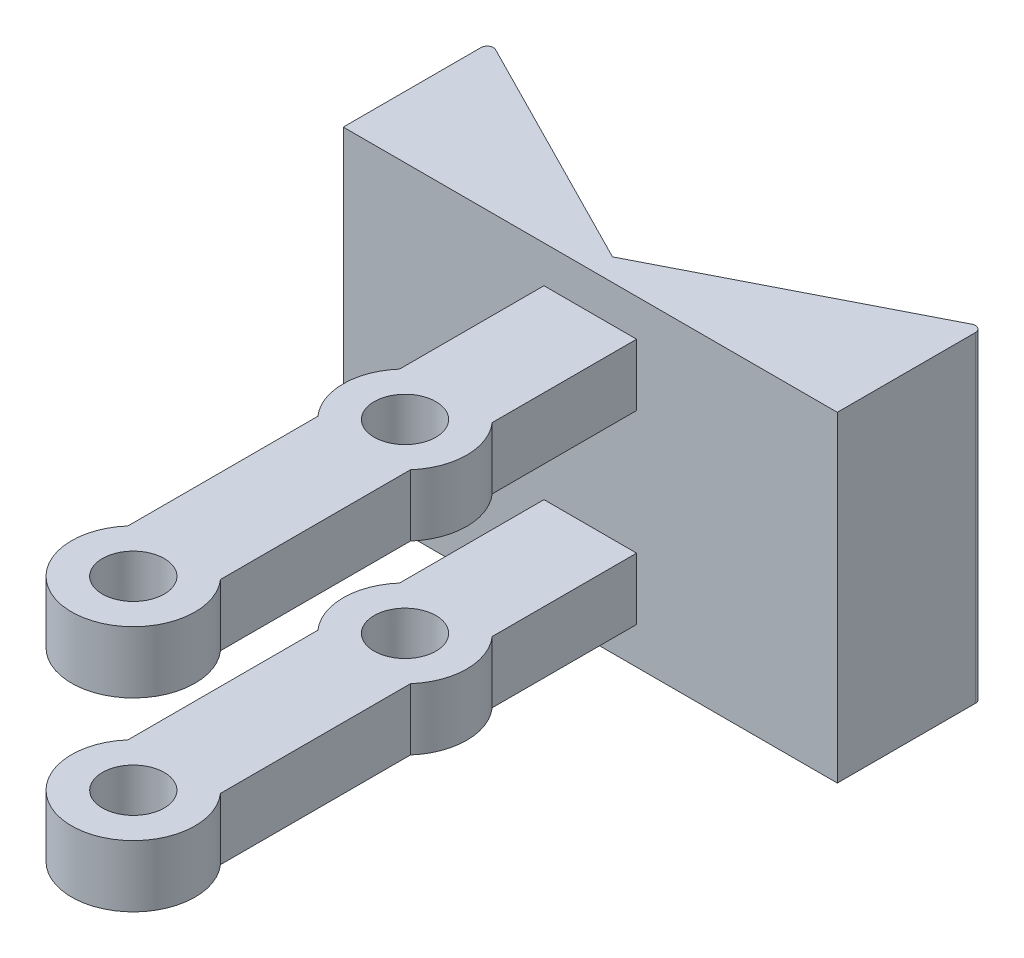
ISO-10303-21;
HEADER;
FILE_DESCRIPTION(('STEP AP214'),'2;1');
FILE_NAME('part.step','',(''),(''),'','','');
FILE_SCHEMA(('AUTOMOTIVE_DESIGN { 1 0 10303 214 1 1 1 1 }'));
ENDSEC;
DATA;
#1=APPLICATION_CONTEXT('core data for automotive mechanical design processes');
#2=APPLICATION_PROTOCOL_DEFINITION('international standard','automotive_design',2000,#1);
#3=PRODUCT_CONTEXT('',#1,'mechanical');
#4=PRODUCT('Part','Part','',(#3));
#5=PRODUCT_RELATED_PRODUCT_CATEGORY('part','',(#4));
#6=PRODUCT_DEFINITION_FORMATION('','',#4);
#7=PRODUCT_DEFINITION_CONTEXT('part definition',#1,'design');
#8=PRODUCT_DEFINITION('design','',#6,#7);
#9=PRODUCT_DEFINITION_SHAPE('','',#8);
#10=(LENGTH_UNIT() NAMED_UNIT(*) SI_UNIT(.MILLI.,.METRE.));
#11=(NAMED_UNIT(*) PLANE_ANGLE_UNIT() SI_UNIT($,.RADIAN.));
#12=(NAMED_UNIT(*) SI_UNIT($,.STERADIAN.) SOLID_ANGLE_UNIT());
#13=UNCERTAINTY_MEASURE_WITH_UNIT(LENGTH_MEASURE(1.E-05),#10,'distance_accuracy_value','');
#14=(GEOMETRIC_REPRESENTATION_CONTEXT(3) GLOBAL_UNCERTAINTY_ASSIGNED_CONTEXT((#13)) GLOBAL_UNIT_ASSIGNED_CONTEXT((#10,
#11,#12)) REPRESENTATION_CONTEXT('',''));
#15=CARTESIAN_POINT('',(0.,0.,0.));
#16=DIRECTION('',(0.,0.,1.));
#17=DIRECTION('',(1.,0.,0.));
#18=AXIS2_PLACEMENT_3D('',#15,#16,#17);
#19=CARTESIAN_POINT('',(-3.75,20.,9.33438241969781));
#20=DIRECTION('',(1.,0.,0.));
#21=DIRECTION('',(0.,0.,-1.));
#22=AXIS2_PLACEMENT_3D('',#19,#20,#21);
#23=PLANE('',#22);
#24=DIRECTION('',(0.,0.,-1.));
#25=VECTOR('',#24,1.);
#26=CARTESIAN_POINT('',(-3.75,15.,9.33438241969781));
#27=LINE('',#26,#25);
#28=CARTESIAN_POINT('',(-3.75,15.,21.0271932808671));
#29=VERTEX_POINT('',#28);
#30=CARTESIAN_POINT('',(-3.75,15.,9.3343824196978));
#31=VERTEX_POINT('',#30);
#32=EDGE_CURVE('E308',#29,#31,#27,.T.);
#33=ORIENTED_EDGE('',*,*,#32,.F.);
#34=DIRECTION('',(0.,-1.,0.));
#35=VECTOR('',#34,1.);
#36=CARTESIAN_POINT('',(-3.75,20.,21.0271932808671));
#37=LINE('',#36,#35);
#38=CARTESIAN_POINT('',(-3.75,20.,21.0271932808671));
#39=VERTEX_POINT('',#38);
#40=EDGE_CURVE('E407',#39,#29,#37,.T.);
#41=ORIENTED_EDGE('',*,*,#40,.F.);
#42=DIRECTION('',(0.,0.,1.));
#43=VECTOR('',#42,1.);
#44=CARTESIAN_POINT('',(-3.75,20.,9.33438241969781));
#45=LINE('',#44,#43);
#46=CARTESIAN_POINT('',(-3.75,20.,9.33438241969781));
#47=VERTEX_POINT('',#46);
#48=EDGE_CURVE('E328',#47,#39,#45,.T.);
#49=ORIENTED_EDGE('',*,*,#48,.F.);
#50=DIRECTION('',(0.,-1.,0.));
#51=VECTOR('',#50,1.);
#52=CARTESIAN_POINT('',(-3.75,20.,9.33438241969781));
#53=LINE('',#52,#51);
#54=EDGE_CURVE('E412',#47,#31,#53,.T.);
#55=ORIENTED_EDGE('',*,*,#54,.T.);
#56=EDGE_LOOP('',(#33,#41,#49,#55));
#57=FACE_BOUND('',#56,.T.);
#58=ADVANCED_FACE('F39',(#57),#23,.F.);
#59=CARTESIAN_POINT('',(0.,20.,24.3343824196978));
#60=DIRECTION('',(0.,-1.,0.));
#61=DIRECTION('',(0.,0.,-1.));
#62=AXIS2_PLACEMENT_3D('',#59,#60,#61);
#63=CYLINDRICAL_SURFACE('',#62,5.);
#64=CARTESIAN_POINT('',(0.,15.,24.3343824196978));
#65=DIRECTION('',(0.,-1.,0.));
#66=DIRECTION('',(0.,0.,-1.));
#67=AXIS2_PLACEMENT_3D('',#64,#65,#66);
#68=CIRCLE('',#67,5.);
#69=CARTESIAN_POINT('',(-3.74999999999999,15.,27.6415715585286));
#70=VERTEX_POINT('',#69);
#71=EDGE_CURVE('E305',#70,#29,#68,.T.);
#72=ORIENTED_EDGE('',*,*,#71,.F.);
#73=DIRECTION('',(0.,-1.,0.));
#74=VECTOR('',#73,1.);
#75=CARTESIAN_POINT('',(-3.74999999999999,20.,27.6415715585286));
#76=LINE('',#75,#74);
#77=CARTESIAN_POINT('',(-3.74999999999999,20.,27.6415715585286));
#78=VERTEX_POINT('',#77);
#79=EDGE_CURVE('E402',#78,#70,#76,.T.);
#80=ORIENTED_EDGE('',*,*,#79,.F.);
#81=CARTESIAN_POINT('',(0.,20.,24.3343824196978));
#82=DIRECTION('',(0.,1.,0.));
#83=DIRECTION('',(0.,0.,1.));
#84=AXIS2_PLACEMENT_3D('',#81,#82,#83);
#85=CIRCLE('',#84,5.);
#86=EDGE_CURVE('E331',#39,#78,#85,.T.);
#87=ORIENTED_EDGE('',*,*,#86,.F.);
#88=ORIENTED_EDGE('',*,*,#40,.T.);
#89=EDGE_LOOP('',(#72,#80,#87,#88));
#90=FACE_BOUND('',#89,.T.);
#91=ADVANCED_FACE('F512',(#90),#63,.T.);
#92=CARTESIAN_POINT('',(-3.74999999999999,20.,27.6415715585286));
#93=DIRECTION('',(1.,0.,0.));
#94=DIRECTION('',(0.,0.,-1.));
#95=AXIS2_PLACEMENT_3D('',#92,#93,#94);
#96=PLANE('',#95);
#97=DIRECTION('',(0.,0.,-1.));
#98=VECTOR('',#97,1.);
#99=CARTESIAN_POINT('',(-3.74999999999999,15.,27.6415715585286));
#100=LINE('',#99,#98);
#101=CARTESIAN_POINT('',(-3.74999999999999,15.,43.0271932808671));
#102=VERTEX_POINT('',#101);
#103=EDGE_CURVE('E302',#102,#70,#100,.T.);
#104=ORIENTED_EDGE('',*,*,#103,.F.);
#105=DIRECTION('',(0.,-1.,0.));
#106=VECTOR('',#105,1.);
#107=CARTESIAN_POINT('',(-3.74999999999999,20.,43.0271932808671));
#108=LINE('',#107,#106);
#109=CARTESIAN_POINT('',(-3.74999999999999,20.,43.0271932808671));
#110=VERTEX_POINT('',#109);
#111=EDGE_CURVE('E397',#110,#102,#108,.T.);
#112=ORIENTED_EDGE('',*,*,#111,.F.);
#113=DIRECTION('',(0.,0.,1.));
#114=VECTOR('',#113,1.);
#115=CARTESIAN_POINT('',(-3.74999999999999,20.,27.6415715585286));
#116=LINE('',#115,#114);
#117=EDGE_CURVE('E335',#78,#110,#116,.T.);
#118=ORIENTED_EDGE('',*,*,#117,.F.);
#119=ORIENTED_EDGE('',*,*,#79,.T.);
#120=EDGE_LOOP('',(#104,#112,#118,#119));
#121=FACE_BOUND('',#120,.T.);
#122=ADVANCED_FACE('F518',(#121),#96,.F.);
#123=CARTESIAN_POINT('',(0.,20.,46.3343824196978));
#124=DIRECTION('',(0.,-1.,0.));
#125=DIRECTION('',(0.,0.,-1.));
#126=AXIS2_PLACEMENT_3D('',#123,#124,#125);
#127=CYLINDRICAL_SURFACE('',#126,5.);
#128=CARTESIAN_POINT('',(0.,15.,46.3343824196978));
#129=DIRECTION('',(0.,-1.,0.));
#130=DIRECTION('',(0.,0.,-1.));
#131=AXIS2_PLACEMENT_3D('',#128,#129,#130);
#132=CIRCLE('',#131,5.);
#133=CARTESIAN_POINT('',(3.75000000000001,15.,43.0271932808671));
#134=VERTEX_POINT('',#133);
#135=EDGE_CURVE('E299',#134,#102,#132,.T.);
#136=ORIENTED_EDGE('',*,*,#135,.F.);
#137=DIRECTION('',(0.,-1.,0.));
#138=VECTOR('',#137,1.);
#139=CARTESIAN_POINT('',(3.75000000000001,20.,43.0271932808671));
#140=LINE('',#139,#138);
#141=CARTESIAN_POINT('',(3.75000000000001,20.,43.0271932808671));
#142=VERTEX_POINT('',#141);
#143=EDGE_CURVE('E392',#142,#134,#140,.T.);
#144=ORIENTED_EDGE('',*,*,#143,.F.);
#145=CARTESIAN_POINT('',(0.,20.,46.3343824196978));
#146=DIRECTION('',(0.,1.,0.));
#147=DIRECTION('',(0.,0.,1.));
#148=AXIS2_PLACEMENT_3D('',#145,#146,#147);
#149=CIRCLE('',#148,5.);
#150=EDGE_CURVE('E338',#110,#142,#149,.T.);
#151=ORIENTED_EDGE('',*,*,#150,.F.);
#152=ORIENTED_EDGE('',*,*,#111,.T.);
#153=EDGE_LOOP('',(#136,#144,#151,#152));
#154=FACE_BOUND('',#153,.T.);
#155=ADVANCED_FACE('F680',(#154),#127,.T.);
#156=CARTESIAN_POINT('',(3.75000000000001,20.,43.0271932808671));
#157=DIRECTION('',(-1.,0.,0.));
#158=DIRECTION('',(0.,0.,1.));
#159=AXIS2_PLACEMENT_3D('',#156,#157,#158);
#160=PLANE('',#159);
#161=DIRECTION('',(0.,0.,1.));
#162=VECTOR('',#161,1.);
#163=CARTESIAN_POINT('',(3.75000000000001,15.,43.0271932808671));
#164=LINE('',#163,#162);
#165=CARTESIAN_POINT('',(3.75,15.,27.6415715585286));
#166=VERTEX_POINT('',#165);
#167=EDGE_CURVE('E296',#166,#134,#164,.T.);
#168=ORIENTED_EDGE('',*,*,#167,.F.);
#169=DIRECTION('',(0.,-1.,0.));
#170=VECTOR('',#169,1.);
#171=CARTESIAN_POINT('',(3.75,20.,27.6415715585286));
#172=LINE('',#171,#170);
#173=CARTESIAN_POINT('',(3.75,20.,27.6415715585286));
#174=VERTEX_POINT('',#173);
#175=EDGE_CURVE('E387',#174,#166,#172,.T.);
#176=ORIENTED_EDGE('',*,*,#175,.F.);
#177=DIRECTION('',(0.,0.,-1.));
#178=VECTOR('',#177,1.);
#179=CARTESIAN_POINT('',(3.75000000000001,20.,43.0271932808671));
#180=LINE('',#179,#178);
#181=EDGE_CURVE('E341',#142,#174,#180,.T.);
#182=ORIENTED_EDGE('',*,*,#181,.F.);
#183=ORIENTED_EDGE('',*,*,#143,.T.);
#184=EDGE_LOOP('',(#168,#176,#182,#183));
#185=FACE_BOUND('',#184,.T.);
#186=ADVANCED_FACE('F508',(#185),#160,.F.);
#187=CARTESIAN_POINT('',(0.,20.,24.3343824196978));
#188=DIRECTION('',(0.,-1.,0.));
#189=DIRECTION('',(0.,0.,-1.));
#190=AXIS2_PLACEMENT_3D('',#187,#188,#189);
#191=CYLINDRICAL_SURFACE('',#190,5.);
#192=CARTESIAN_POINT('',(0.,15.,24.3343824196978));
#193=DIRECTION('',(0.,-1.,0.));
#194=DIRECTION('',(0.,0.,-1.));
#195=AXIS2_PLACEMENT_3D('',#192,#193,#194);
#196=CIRCLE('',#195,5.);
#197=CARTESIAN_POINT('',(3.75,15.,21.0271932808671));
#198=VERTEX_POINT('',#197);
#199=EDGE_CURVE('E293',#198,#166,#196,.T.);
#200=ORIENTED_EDGE('',*,*,#199,.F.);
#201=DIRECTION('',(0.,-1.,0.));
#202=VECTOR('',#201,1.);
#203=CARTESIAN_POINT('',(3.75000000000001,20.,21.0271932808671));
#204=LINE('',#203,#202);
#205=CARTESIAN_POINT('',(3.75000000000001,20.,21.0271932808671));
#206=VERTEX_POINT('',#205);
#207=EDGE_CURVE('E382',#206,#198,#204,.T.);
#208=ORIENTED_EDGE('',*,*,#207,.F.);
#209=CARTESIAN_POINT('',(0.,20.,24.3343824196978));
#210=DIRECTION('',(0.,1.,0.));
#211=DIRECTION('',(0.,0.,1.));
#212=AXIS2_PLACEMENT_3D('',#209,#210,#211);
#213=CIRCLE('',#212,5.);
#214=EDGE_CURVE('E344',#174,#206,#213,.T.);
#215=ORIENTED_EDGE('',*,*,#214,.F.);
#216=ORIENTED_EDGE('',*,*,#175,.T.);
#217=EDGE_LOOP('',(#200,#208,#215,#216));
#218=FACE_BOUND('',#217,.T.);
#219=ADVANCED_FACE('F499',(#218),#191,.T.);
#220=CARTESIAN_POINT('',(3.75,20.,21.0271932808671));
#221=DIRECTION('',(-1.,0.,0.));
#222=DIRECTION('',(0.,0.,1.));
#223=AXIS2_PLACEMENT_3D('',#220,#221,#222);
#224=PLANE('',#223);
#225=DIRECTION('',(0.,0.,1.));
#226=VECTOR('',#225,1.);
#227=CARTESIAN_POINT('',(3.75,15.,21.0271932808671));
#228=LINE('',#227,#226);
#229=CARTESIAN_POINT('',(3.75,15.,9.3343824196978));
#230=VERTEX_POINT('',#229);
#231=EDGE_CURVE('E290',#230,#198,#228,.T.);
#232=ORIENTED_EDGE('',*,*,#231,.F.);
#233=DIRECTION('',(0.,-1.,0.));
#234=VECTOR('',#233,1.);
#235=CARTESIAN_POINT('',(3.75,20.,9.33438241969781));
#236=LINE('',#235,#234);
#237=CARTESIAN_POINT('',(3.75,20.,9.33438241969781));
#238=VERTEX_POINT('',#237);
#239=EDGE_CURVE('E377',#238,#230,#236,.T.);
#240=ORIENTED_EDGE('',*,*,#239,.F.);
#241=DIRECTION('',(0.,0.,-1.));
#242=VECTOR('',#241,1.);
#243=CARTESIAN_POINT('',(3.75,20.,21.0271932808671));
#244=LINE('',#243,#242);
#245=EDGE_CURVE('E347',#206,#238,#244,.T.);
#246=ORIENTED_EDGE('',*,*,#245,.F.);
#247=ORIENTED_EDGE('',*,*,#207,.T.);
#248=EDGE_LOOP('',(#232,#240,#246,#247));
#249=FACE_BOUND('',#248,.T.);
#250=ADVANCED_FACE('F506',(#249),#224,.F.);
#251=CARTESIAN_POINT('',(0.,20.,24.3343824196978));
#252=DIRECTION('',(0.,-1.,0.));
#253=DIRECTION('',(0.,0.,-1.));
#254=AXIS2_PLACEMENT_3D('',#251,#252,#253);
#255=CYLINDRICAL_SURFACE('',#254,2.5);
#256=CARTESIAN_POINT('',(0.,20.,24.3343824196978));
#257=DIRECTION('',(0.,1.,0.));
#258=DIRECTION('',(0.,0.,1.));
#259=AXIS2_PLACEMENT_3D('',#256,#257,#258);
#260=CIRCLE('',#259,2.5);
#261=CARTESIAN_POINT('',(0.,20.,26.8343824196978));
#262=VERTEX_POINT('',#261);
#263=EDGE_CURVE('E320',#262,#262,#260,.T.);
#264=ORIENTED_EDGE('',*,*,#263,.T.);
#265=EDGE_LOOP('',(#264));
#266=FACE_BOUND('',#265,.T.);
#267=CARTESIAN_POINT('',(0.,15.,24.3343824196978));
#268=DIRECTION('',(0.,-1.,0.));
#269=DIRECTION('',(0.,0.,-1.));
#270=AXIS2_PLACEMENT_3D('',#267,#268,#269);
#271=CIRCLE('',#270,2.5);
#272=CARTESIAN_POINT('',(0.,15.,21.8343824196978));
#273=VERTEX_POINT('',#272);
#274=EDGE_CURVE('E286',#273,#273,#271,.T.);
#275=ORIENTED_EDGE('',*,*,#274,.T.);
#276=EDGE_LOOP('',(#275));
#277=FACE_BOUND('',#276,.T.);
#278=ADVANCED_FACE('F584',(#266,#277),#255,.F.);
#279=CARTESIAN_POINT('',(0.,20.,46.3343824196978));
#280=DIRECTION('',(0.,-1.,0.));
#281=DIRECTION('',(0.,0.,-1.));
#282=AXIS2_PLACEMENT_3D('',#279,#280,#281);
#283=CYLINDRICAL_SURFACE('',#282,2.5);
#284=CARTESIAN_POINT('',(0.,20.,46.3343824196978));
#285=DIRECTION('',(0.,1.,0.));
#286=DIRECTION('',(0.,0.,1.));
#287=AXIS2_PLACEMENT_3D('',#284,#285,#286);
#288=CIRCLE('',#287,2.5);
#289=CARTESIAN_POINT('',(0.,20.,48.8343824196978));
#290=VERTEX_POINT('',#289);
#291=EDGE_CURVE('E312',#290,#290,#288,.T.);
#292=ORIENTED_EDGE('',*,*,#291,.T.);
#293=EDGE_LOOP('',(#292));
#294=FACE_BOUND('',#293,.T.);
#295=CARTESIAN_POINT('',(0.,15.,46.3343824196978));
#296=DIRECTION('',(0.,-1.,0.));
#297=DIRECTION('',(0.,0.,-1.));
#298=AXIS2_PLACEMENT_3D('',#295,#296,#297);
#299=CIRCLE('',#298,2.5);
#300=CARTESIAN_POINT('',(0.,15.,43.8343824196978));
#301=VERTEX_POINT('',#300);
#302=EDGE_CURVE('E285',#301,#301,#299,.T.);
#303=ORIENTED_EDGE('',*,*,#302,.T.);
#304=EDGE_LOOP('',(#303));
#305=FACE_BOUND('',#304,.T.);
#306=ADVANCED_FACE('F580',(#294,#305),#283,.F.);
#307=CARTESIAN_POINT('',(0.,20.,24.3343824196978));
#308=DIRECTION('',(0.,1.,0.));
#309=DIRECTION('',(0.,0.,1.));
#310=AXIS2_PLACEMENT_3D('',#307,#308,#309);
#311=PLANE('',#310);
#312=DIRECTION('',(1.,0.,0.));
#313=VECTOR('',#312,1.);
#314=CARTESIAN_POINT('',(-20.,20.,9.33438241969781));
#315=LINE('',#314,#313);
#316=EDGE_CURVE('E225',#47,#238,#315,.T.);
#317=ORIENTED_EDGE('',*,*,#316,.F.);
#318=ORIENTED_EDGE('',*,*,#48,.T.);
#319=ORIENTED_EDGE('',*,*,#86,.T.);
#320=ORIENTED_EDGE('',*,*,#117,.T.);
#321=ORIENTED_EDGE('',*,*,#150,.T.);
#322=ORIENTED_EDGE('',*,*,#181,.T.);
#323=ORIENTED_EDGE('',*,*,#214,.T.);
#324=ORIENTED_EDGE('',*,*,#245,.T.);
#325=EDGE_LOOP('',(#317,#318,#319,#320,#321,#322,#323,#324));
#326=FACE_BOUND('',#325,.T.);
#327=ORIENTED_EDGE('',*,*,#263,.F.);
#328=EDGE_LOOP('',(#327));
#329=FACE_BOUND('',#328,.T.);
#330=ORIENTED_EDGE('',*,*,#291,.F.);
#331=EDGE_LOOP('',(#330));
#332=FACE_BOUND('',#331,.T.);
#333=ADVANCED_FACE('F585',(#326,#329,#332),#311,.T.);
#334=CARTESIAN_POINT('',(0.,0.,24.3343824196978));
#335=DIRECTION('',(0.,1.,0.));
#336=DIRECTION('',(0.,0.,1.));
#337=AXIS2_PLACEMENT_3D('',#334,#335,#336);
#338=PLANE('',#337);
#339=DIRECTION('',(0.,0.,1.));
#340=VECTOR('',#339,1.);
#341=CARTESIAN_POINT('',(-3.75,0.,9.33438241969781));
#342=LINE('',#341,#340);
#343=CARTESIAN_POINT('',(-3.75,0.,9.33438241969781));
#344=VERTEX_POINT('',#343);
#345=CARTESIAN_POINT('',(-3.75,0.,21.0271932808671));
#346=VERTEX_POINT('',#345);
#347=EDGE_CURVE('E324',#344,#346,#342,.T.);
#348=ORIENTED_EDGE('',*,*,#347,.F.);
#349=DIRECTION('',(1.,0.,0.));
#350=VECTOR('',#349,1.);
#351=CARTESIAN_POINT('',(-20.,0.,9.33438241969781));
#352=LINE('',#351,#350);
#353=CARTESIAN_POINT('',(3.75,0.,9.33438241969781));
#354=VERTEX_POINT('',#353);
#355=EDGE_CURVE('E221',#344,#354,#352,.T.);
#356=ORIENTED_EDGE('',*,*,#355,.T.);
#357=DIRECTION('',(0.,0.,-1.));
#358=VECTOR('',#357,1.);
#359=CARTESIAN_POINT('',(3.75,0.,21.0271932808671));
#360=LINE('',#359,#358);
#361=CARTESIAN_POINT('',(3.75000000000001,0.,21.0271932808671));
#362=VERTEX_POINT('',#361);
#363=EDGE_CURVE('E332',#362,#354,#360,.T.);
#364=ORIENTED_EDGE('',*,*,#363,.F.);
#365=CARTESIAN_POINT('',(0.,0.,24.3343824196978));
#366=DIRECTION('',(0.,1.,0.));
#367=DIRECTION('',(0.,0.,1.));
#368=AXIS2_PLACEMENT_3D('',#365,#366,#367);
#369=CIRCLE('',#368,5.);
#370=CARTESIAN_POINT('',(3.75,0.,27.6415715585286));
#371=VERTEX_POINT('',#370);
#372=EDGE_CURVE('E370',#371,#362,#369,.T.);
#373=ORIENTED_EDGE('',*,*,#372,.F.);
#374=DIRECTION('',(0.,0.,-1.));
#375=VECTOR('',#374,1.);
#376=CARTESIAN_POINT('',(3.75000000000001,0.,43.0271932808671));
#377=LINE('',#376,#375);
#378=CARTESIAN_POINT('',(3.75000000000001,0.,43.0271932808671));
#379=VERTEX_POINT('',#378);
#380=EDGE_CURVE('E366',#379,#371,#377,.T.);
#381=ORIENTED_EDGE('',*,*,#380,.F.);
#382=CARTESIAN_POINT('',(0.,0.,46.3343824196978));
#383=DIRECTION('',(0.,1.,0.));
#384=DIRECTION('',(0.,0.,1.));
#385=AXIS2_PLACEMENT_3D('',#382,#383,#384);
#386=CIRCLE('',#385,5.);
#387=CARTESIAN_POINT('',(-3.74999999999999,0.,43.0271932808671));
#388=VERTEX_POINT('',#387);
#389=EDGE_CURVE('E362',#388,#379,#386,.T.);
#390=ORIENTED_EDGE('',*,*,#389,.F.);
#391=DIRECTION('',(0.,0.,1.));
#392=VECTOR('',#391,1.);
#393=CARTESIAN_POINT('',(-3.74999999999999,0.,27.6415715585286));
#394=LINE('',#393,#392);
#395=CARTESIAN_POINT('',(-3.74999999999999,0.,27.6415715585286));
#396=VERTEX_POINT('',#395);
#397=EDGE_CURVE('E358',#396,#388,#394,.T.);
#398=ORIENTED_EDGE('',*,*,#397,.F.);
#399=CARTESIAN_POINT('',(0.,0.,24.3343824196978));
#400=DIRECTION('',(0.,1.,0.));
#401=DIRECTION('',(0.,0.,1.));
#402=AXIS2_PLACEMENT_3D('',#399,#400,#401);
#403=CIRCLE('',#402,5.);
#404=EDGE_CURVE('E354',#346,#396,#403,.T.);
#405=ORIENTED_EDGE('',*,*,#404,.F.);
#406=EDGE_LOOP('',(#348,#356,#364,#373,#381,#390,#398,#405));
#407=FACE_BOUND('',#406,.T.);
#408=CARTESIAN_POINT('',(0.,0.,24.3343824196978));
#409=DIRECTION('',(0.,1.,0.));
#410=DIRECTION('',(0.,0.,1.));
#411=AXIS2_PLACEMENT_3D('',#408,#409,#410);
#412=CIRCLE('',#411,2.5);
#413=CARTESIAN_POINT('',(0.,0.,26.8343824196978));
#414=VERTEX_POINT('',#413);
#415=EDGE_CURVE('E316',#414,#414,#412,.T.);
#416=ORIENTED_EDGE('',*,*,#415,.T.);
#417=EDGE_LOOP('',(#416));
#418=FACE_BOUND('',#417,.T.);
#419=CARTESIAN_POINT('',(0.,0.,46.3343824196978));
#420=DIRECTION('',(0.,1.,0.));
#421=DIRECTION('',(0.,0.,1.));
#422=AXIS2_PLACEMENT_3D('',#419,#420,#421);
#423=CIRCLE('',#422,2.5);
#424=CARTESIAN_POINT('',(0.,0.,48.8343824196978));
#425=VERTEX_POINT('',#424);
#426=EDGE_CURVE('E311',#425,#425,#423,.T.);
#427=ORIENTED_EDGE('',*,*,#426,.T.);
#428=EDGE_LOOP('',(#427));
#429=FACE_BOUND('',#428,.T.);
#430=ADVANCED_FACE('F472',(#407,#418,#429),#338,.F.);
#431=CARTESIAN_POINT('',(20.,20.,-9.33438241969781));
#432=DIRECTION('',(-1.,0.,0.));
#433=DIRECTION('',(0.,0.,1.));
#434=AXIS2_PLACEMENT_3D('',#431,#432,#433);
#435=PLANE('',#434);
#436=DIRECTION('',(0.,0.,1.));
#437=VECTOR('',#436,1.);
#438=CARTESIAN_POINT('',(20.,-3.00000000000001,-49.446724659961));
#439=LINE('',#438,#437);
#440=CARTESIAN_POINT('',(20.,-3.00000000000001,-1.8512779261436));
#441=VERTEX_POINT('',#440);
#442=CARTESIAN_POINT('',(20.,-3.00000000000001,9.33438241969781));
#443=VERTEX_POINT('',#442);
#444=EDGE_CURVE('E226',#441,#443,#439,.T.);
#445=ORIENTED_EDGE('',*,*,#444,.F.);
#446=DIRECTION('',(0.,1.,0.));
#447=VECTOR('',#446,1.);
#448=CARTESIAN_POINT('',(20.,20.,-1.8512779261436));
#449=LINE('',#448,#447);
#450=CARTESIAN_POINT('',(20.,23.,-1.8512779261436));
#451=VERTEX_POINT('',#450);
#452=EDGE_CURVE('E443',#441,#451,#449,.T.);
#453=ORIENTED_EDGE('',*,*,#452,.T.);
#454=DIRECTION('',(0.,0.,1.));
#455=VECTOR('',#454,1.);
#456=CARTESIAN_POINT('',(20.,23.,-49.446724659961));
#457=LINE('',#456,#455);
#458=CARTESIAN_POINT('',(20.,23.,9.33438241969781));
#459=VERTEX_POINT('',#458);
#460=EDGE_CURVE('E239',#451,#459,#457,.T.);
#461=ORIENTED_EDGE('',*,*,#460,.T.);
#462=DIRECTION('',(0.,-1.,0.));
#463=VECTOR('',#462,1.);
#464=CARTESIAN_POINT('',(20.,20.,9.3343824196978));
#465=LINE('',#464,#463);
#466=EDGE_CURVE('E235',#459,#443,#465,.T.);
#467=ORIENTED_EDGE('',*,*,#466,.T.);
#468=EDGE_LOOP('',(#445,#453,#461,#467));
#469=FACE_BOUND('',#468,.T.);
#470=ADVANCED_FACE('F532',(#469),#435,.F.);
#471=CARTESIAN_POINT('',(-20.,20.,-9.3343824196978));
#472=DIRECTION('',(1.,0.,0.));
#473=DIRECTION('',(0.,0.,-1.));
#474=AXIS2_PLACEMENT_3D('',#471,#472,#473);
#475=PLANE('',#474);
#476=DIRECTION('',(0.,0.,1.));
#477=VECTOR('',#476,1.);
#478=CARTESIAN_POINT('',(-20.,23.,-49.446724659961));
#479=LINE('',#478,#477);
#480=CARTESIAN_POINT('',(-20.,23.,-1.81965075940068));
#481=VERTEX_POINT('',#480);
#482=CARTESIAN_POINT('',(-20.,23.,9.33438241969781));
#483=VERTEX_POINT('',#482);
#484=EDGE_CURVE('E240',#481,#483,#479,.T.);
#485=ORIENTED_EDGE('',*,*,#484,.F.);
#486=DIRECTION('',(0.,-1.,0.));
#487=VECTOR('',#486,1.);
#488=CARTESIAN_POINT('',(-20.,20.,-1.81965075940068));
#489=LINE('',#488,#487);
#490=CARTESIAN_POINT('',(-20.,-3.,-1.81965075940068));
#491=VERTEX_POINT('',#490);
#492=EDGE_CURVE('E437',#481,#491,#489,.T.);
#493=ORIENTED_EDGE('',*,*,#492,.T.);
#494=DIRECTION('',(0.,0.,1.));
#495=VECTOR('',#494,1.);
#496=CARTESIAN_POINT('',(-20.,-3.,-49.446724659961));
#497=LINE('',#496,#495);
#498=CARTESIAN_POINT('',(-20.,-3.,9.33438241969781));
#499=VERTEX_POINT('',#498);
#500=EDGE_CURVE('E220',#491,#499,#497,.T.);
#501=ORIENTED_EDGE('',*,*,#500,.T.);
#502=DIRECTION('',(0.,-1.,0.));
#503=VECTOR('',#502,1.);
#504=CARTESIAN_POINT('',(-20.,20.,9.3343824196978));
#505=LINE('',#504,#503);
#506=EDGE_CURVE('E416',#483,#499,#505,.T.);
#507=ORIENTED_EDGE('',*,*,#506,.F.);
#508=EDGE_LOOP('',(#485,#493,#501,#507));
#509=FACE_BOUND('',#508,.T.);
#510=ADVANCED_FACE('F528',(#509),#475,.F.);
#511=CARTESIAN_POINT('',(-20.,20.,9.3343824196978));
#512=DIRECTION('',(0.,0.,-1.));
#513=DIRECTION('',(-1.,0.,0.));
#514=AXIS2_PLACEMENT_3D('',#511,#512,#513);
#515=PLANE('',#514);
#516=ORIENTED_EDGE('',*,*,#355,.F.);
#517=CARTESIAN_POINT('',(-3.75,5.,9.3343824196978));
#518=VERTEX_POINT('',#517);
#519=EDGE_CURVE('E411',#518,#344,#53,.T.);
#520=ORIENTED_EDGE('',*,*,#519,.F.);
#521=DIRECTION('',(-1.,0.,0.));
#522=VECTOR('',#521,1.);
#523=CARTESIAN_POINT('',(-11.875,5.,9.3343824196978));
#524=LINE('',#523,#522);
#525=CARTESIAN_POINT('',(3.75,5.,9.3343824196978));
#526=VERTEX_POINT('',#525);
#527=EDGE_CURVE('E243',#526,#518,#524,.T.);
#528=ORIENTED_EDGE('',*,*,#527,.F.);
#529=EDGE_CURVE('E350',#526,#354,#236,.T.);
#530=ORIENTED_EDGE('',*,*,#529,.T.);
#531=EDGE_LOOP('',(#516,#520,#528,#530));
#532=FACE_BOUND('',#531,.T.);
#533=ORIENTED_EDGE('',*,*,#54,.F.);
#534=ORIENTED_EDGE('',*,*,#316,.T.);
#535=ORIENTED_EDGE('',*,*,#239,.T.);
#536=DIRECTION('',(-1.,0.,0.));
#537=VECTOR('',#536,1.);
#538=CARTESIAN_POINT('',(-11.875,15.,9.3343824196978));
#539=LINE('',#538,#537);
#540=EDGE_CURVE('E248',#230,#31,#539,.T.);
#541=ORIENTED_EDGE('',*,*,#540,.T.);
#542=EDGE_LOOP('',(#533,#534,#535,#541));
#543=FACE_BOUND('',#542,.T.);
#544=DIRECTION('',(-1.,0.,0.));
#545=VECTOR('',#544,1.);
#546=CARTESIAN_POINT('',(20.,23.,9.33438241969781));
#547=LINE('',#546,#545);
#548=EDGE_CURVE('E229',#459,#483,#547,.T.);
#549=ORIENTED_EDGE('',*,*,#548,.T.);
#550=ORIENTED_EDGE('',*,*,#506,.T.);
#551=DIRECTION('',(-1.,0.,0.));
#552=VECTOR('',#551,1.);
#553=CARTESIAN_POINT('',(20.,-3.00000000000001,9.33438241969781));
#554=LINE('',#553,#552);
#555=EDGE_CURVE('E209',#443,#499,#554,.T.);
#556=ORIENTED_EDGE('',*,*,#555,.F.);
#557=ORIENTED_EDGE('',*,*,#466,.F.);
#558=EDGE_LOOP('',(#549,#550,#556,#557));
#559=FACE_BOUND('',#558,.T.);
#560=ADVANCED_FACE('F462',(#532,#543,#559),#515,.F.);
#561=CARTESIAN_POINT('',(-3.75,5.,21.0271932808671));
#562=VERTEX_POINT('',#561);
#563=EDGE_CURVE('E406',#562,#346,#37,.T.);
#564=ORIENTED_EDGE('',*,*,#563,.F.);
#565=DIRECTION('',(0.,0.,-1.));
#566=VECTOR('',#565,1.);
#567=CARTESIAN_POINT('',(-3.75,5.,9.33438241969781));
#568=LINE('',#567,#566);
#569=EDGE_CURVE('E281',#562,#518,#568,.T.);
#570=ORIENTED_EDGE('',*,*,#569,.T.);
#571=ORIENTED_EDGE('',*,*,#519,.T.);
#572=ORIENTED_EDGE('',*,*,#347,.T.);
#573=EDGE_LOOP('',(#564,#570,#571,#572));
#574=FACE_BOUND('',#573,.T.);
#575=ADVANCED_FACE('F479',(#574),#23,.F.);
#576=CARTESIAN_POINT('',(-3.74999999999999,5.,27.6415715585286));
#577=VERTEX_POINT('',#576);
#578=EDGE_CURVE('E401',#577,#396,#76,.T.);
#579=ORIENTED_EDGE('',*,*,#578,.F.);
#580=CARTESIAN_POINT('',(0.,5.,24.3343824196978));
#581=DIRECTION('',(0.,-1.,0.));
#582=DIRECTION('',(0.,0.,-1.));
#583=AXIS2_PLACEMENT_3D('',#580,#581,#582);
#584=CIRCLE('',#583,5.);
#585=EDGE_CURVE('E277',#577,#562,#584,.T.);
#586=ORIENTED_EDGE('',*,*,#585,.T.);
#587=ORIENTED_EDGE('',*,*,#563,.T.);
#588=ORIENTED_EDGE('',*,*,#404,.T.);
#589=EDGE_LOOP('',(#579,#586,#587,#588));
#590=FACE_BOUND('',#589,.T.);
#591=ADVANCED_FACE('F484',(#590),#63,.T.);
#592=CARTESIAN_POINT('',(-3.74999999999999,5.,43.0271932808671));
#593=VERTEX_POINT('',#592);
#594=EDGE_CURVE('E396',#593,#388,#108,.T.);
#595=ORIENTED_EDGE('',*,*,#594,.F.);
#596=DIRECTION('',(0.,0.,-1.));
#597=VECTOR('',#596,1.);
#598=CARTESIAN_POINT('',(-3.74999999999999,5.,27.6415715585286));
#599=LINE('',#598,#597);
#600=EDGE_CURVE('E273',#593,#577,#599,.T.);
#601=ORIENTED_EDGE('',*,*,#600,.T.);
#602=ORIENTED_EDGE('',*,*,#578,.T.);
#603=ORIENTED_EDGE('',*,*,#397,.T.);
#604=EDGE_LOOP('',(#595,#601,#602,#603));
#605=FACE_BOUND('',#604,.T.);
#606=ADVANCED_FACE('F487',(#605),#96,.F.);
#607=CARTESIAN_POINT('',(3.75000000000001,5.,43.0271932808671));
#608=VERTEX_POINT('',#607);
#609=EDGE_CURVE('E391',#608,#379,#140,.T.);
#610=ORIENTED_EDGE('',*,*,#609,.F.);
#611=CARTESIAN_POINT('',(0.,5.,46.3343824196978));
#612=DIRECTION('',(0.,-1.,0.));
#613=DIRECTION('',(0.,0.,-1.));
#614=AXIS2_PLACEMENT_3D('',#611,#612,#613);
#615=CIRCLE('',#614,5.);
#616=EDGE_CURVE('E269',#608,#593,#615,.T.);
#617=ORIENTED_EDGE('',*,*,#616,.T.);
#618=ORIENTED_EDGE('',*,*,#594,.T.);
#619=ORIENTED_EDGE('',*,*,#389,.T.);
#620=EDGE_LOOP('',(#610,#617,#618,#619));
#621=FACE_BOUND('',#620,.T.);
#622=ADVANCED_FACE('F491',(#621),#127,.T.);
#623=CARTESIAN_POINT('',(3.75,5.,27.6415715585286));
#624=VERTEX_POINT('',#623);
#625=EDGE_CURVE('E386',#624,#371,#172,.T.);
#626=ORIENTED_EDGE('',*,*,#625,.F.);
#627=DIRECTION('',(0.,0.,1.));
#628=VECTOR('',#627,1.);
#629=CARTESIAN_POINT('',(3.75000000000001,5.,43.0271932808671));
#630=LINE('',#629,#628);
#631=EDGE_CURVE('E265',#624,#608,#630,.T.);
#632=ORIENTED_EDGE('',*,*,#631,.T.);
#633=ORIENTED_EDGE('',*,*,#609,.T.);
#634=ORIENTED_EDGE('',*,*,#380,.T.);
#635=EDGE_LOOP('',(#626,#632,#633,#634));
#636=FACE_BOUND('',#635,.T.);
#637=ADVANCED_FACE('F494',(#636),#160,.F.);
#638=CARTESIAN_POINT('',(3.75000000000001,5.,21.0271932808671));
#639=VERTEX_POINT('',#638);
#640=EDGE_CURVE('E381',#639,#362,#204,.T.);
#641=ORIENTED_EDGE('',*,*,#640,.F.);
#642=CARTESIAN_POINT('',(0.,5.,24.3343824196978));
#643=DIRECTION('',(0.,-1.,0.));
#644=DIRECTION('',(0.,0.,-1.));
#645=AXIS2_PLACEMENT_3D('',#642,#643,#644);
#646=CIRCLE('',#645,5.);
#647=EDGE_CURVE('E261',#639,#624,#646,.T.);
#648=ORIENTED_EDGE('',*,*,#647,.T.);
#649=ORIENTED_EDGE('',*,*,#625,.T.);
#650=ORIENTED_EDGE('',*,*,#372,.T.);
#651=EDGE_LOOP('',(#641,#648,#649,#650));
#652=FACE_BOUND('',#651,.T.);
#653=ADVANCED_FACE('F496',(#652),#191,.T.);
#654=ORIENTED_EDGE('',*,*,#529,.F.);
#655=DIRECTION('',(0.,0.,1.));
#656=VECTOR('',#655,1.);
#657=CARTESIAN_POINT('',(3.75,5.,21.0271932808671));
#658=LINE('',#657,#656);
#659=EDGE_CURVE('E257',#526,#639,#658,.T.);
#660=ORIENTED_EDGE('',*,*,#659,.T.);
#661=ORIENTED_EDGE('',*,*,#640,.T.);
#662=ORIENTED_EDGE('',*,*,#363,.T.);
#663=EDGE_LOOP('',(#654,#660,#661,#662));
#664=FACE_BOUND('',#663,.T.);
#665=ADVANCED_FACE('F467',(#664),#224,.F.);
#666=CARTESIAN_POINT('',(0.,5.,24.3343824196978));
#667=DIRECTION('',(0.,-1.,0.));
#668=DIRECTION('',(0.,0.,-1.));
#669=AXIS2_PLACEMENT_3D('',#666,#667,#668);
#670=CIRCLE('',#669,2.5);
#671=CARTESIAN_POINT('',(0.,5.,21.8343824196978));
#672=VERTEX_POINT('',#671);
#673=EDGE_CURVE('E253',#672,#672,#670,.T.);
#674=ORIENTED_EDGE('',*,*,#673,.F.);
#675=EDGE_LOOP('',(#674));
#676=FACE_BOUND('',#675,.T.);
#677=ORIENTED_EDGE('',*,*,#415,.F.);
#678=EDGE_LOOP('',(#677));
#679=FACE_BOUND('',#678,.T.);
#680=ADVANCED_FACE('F504',(#676,#679),#255,.F.);
#681=CARTESIAN_POINT('',(0.,5.,46.3343824196978));
#682=DIRECTION('',(0.,-1.,0.));
#683=DIRECTION('',(0.,0.,-1.));
#684=AXIS2_PLACEMENT_3D('',#681,#682,#683);
#685=CIRCLE('',#684,2.5);
#686=CARTESIAN_POINT('',(0.,5.,43.8343824196978));
#687=VERTEX_POINT('',#686);
#688=EDGE_CURVE('E252',#687,#687,#685,.T.);
#689=ORIENTED_EDGE('',*,*,#688,.F.);
#690=EDGE_LOOP('',(#689));
#691=FACE_BOUND('',#690,.T.);
#692=ORIENTED_EDGE('',*,*,#426,.F.);
#693=EDGE_LOOP('',(#692));
#694=FACE_BOUND('',#693,.T.);
#695=ADVANCED_FACE('F575',(#691,#694),#283,.F.);
#696=CARTESIAN_POINT('',(0.,15.,0.));
#697=DIRECTION('',(0.,-1.,0.));
#698=DIRECTION('',(0.,0.,-1.));
#699=AXIS2_PLACEMENT_3D('',#696,#697,#698);
#700=PLANE('',#699);
#701=ORIENTED_EDGE('',*,*,#302,.F.);
#702=EDGE_LOOP('',(#701));
#703=FACE_BOUND('',#702,.T.);
#704=ORIENTED_EDGE('',*,*,#274,.F.);
#705=EDGE_LOOP('',(#704));
#706=FACE_BOUND('',#705,.T.);
#707=ORIENTED_EDGE('',*,*,#32,.T.);
#708=ORIENTED_EDGE('',*,*,#540,.F.);
#709=ORIENTED_EDGE('',*,*,#231,.T.);
#710=ORIENTED_EDGE('',*,*,#199,.T.);
#711=ORIENTED_EDGE('',*,*,#167,.T.);
#712=ORIENTED_EDGE('',*,*,#135,.T.);
#713=ORIENTED_EDGE('',*,*,#103,.T.);
#714=ORIENTED_EDGE('',*,*,#71,.T.);
#715=EDGE_LOOP('',(#707,#708,#709,#710,#711,#712,#713,#714));
#716=FACE_BOUND('',#715,.T.);
#717=ADVANCED_FACE('F571',(#703,#706,#716),#700,.T.);
#718=CARTESIAN_POINT('',(0.,5.,0.));
#719=DIRECTION('',(0.,-1.,0.));
#720=DIRECTION('',(0.,0.,-1.));
#721=AXIS2_PLACEMENT_3D('',#718,#719,#720);
#722=PLANE('',#721);
#723=ORIENTED_EDGE('',*,*,#673,.T.);
#724=EDGE_LOOP('',(#723));
#725=FACE_BOUND('',#724,.T.);
#726=ORIENTED_EDGE('',*,*,#688,.T.);
#727=EDGE_LOOP('',(#726));
#728=FACE_BOUND('',#727,.T.);
#729=ORIENTED_EDGE('',*,*,#585,.F.);
#730=ORIENTED_EDGE('',*,*,#600,.F.);
#731=ORIENTED_EDGE('',*,*,#616,.F.);
#732=ORIENTED_EDGE('',*,*,#631,.F.);
#733=ORIENTED_EDGE('',*,*,#647,.F.);
#734=ORIENTED_EDGE('',*,*,#659,.F.);
#735=ORIENTED_EDGE('',*,*,#527,.T.);
#736=ORIENTED_EDGE('',*,*,#569,.F.);
#737=EDGE_LOOP('',(#729,#730,#731,#732,#733,#734,#735,#736));
#738=FACE_BOUND('',#737,.T.);
#739=ADVANCED_FACE('F481',(#725,#728,#738),#722,.F.);
#740=CARTESIAN_POINT('',(20.,23.,-49.446724659961));
#741=DIRECTION('',(0.,1.,0.));
#742=DIRECTION('',(-1.,0.,0.));
#743=AXIS2_PLACEMENT_3D('',#740,#741,#742);
#744=PLANE('',#743);
#745=ORIENTED_EDGE('',*,*,#460,.F.);
#746=CARTESIAN_POINT('',(19.5,23.,-1.8512779261436));
#747=DIRECTION('',(0.,1.,0.));
#748=DIRECTION('',(-1.,0.,0.));
#749=AXIS2_PLACEMENT_3D('',#746,#747,#748);
#750=CIRCLE('',#749,0.5);
#751=CARTESIAN_POINT('',(19.2728015406264,23.,-2.29667758943293));
#752=VERTEX_POINT('',#751);
#753=EDGE_CURVE('E62',#451,#752,#750,.T.);
#754=ORIENTED_EDGE('',*,*,#753,.T.);
#755=DIRECTION('',(0.890799326578661,0.,-0.45439691874726));
#756=VECTOR('',#755,1.);
#757=CARTESIAN_POINT('',(0.,23.,7.53438241969781));
#758=LINE('',#757,#756);
#759=CARTESIAN_POINT('',(0.,23.,7.53438241969781));
#760=VERTEX_POINT('',#759);
#761=EDGE_CURVE('E204',#760,#752,#758,.T.);
#762=ORIENTED_EDGE('',*,*,#761,.F.);
#763=DIRECTION('',(0.891390666485437,0.,0.453235788197102));
#764=VECTOR('',#763,1.);
#765=CARTESIAN_POINT('',(-20.0606064987028,23.,-2.66561758030219));
#766=LINE('',#765,#764);
#767=CARTESIAN_POINT('',(-19.2733821059015,23.,-2.2653460926434));
#768=VERTEX_POINT('',#767);
#769=EDGE_CURVE('E195',#768,#760,#766,.T.);
#770=ORIENTED_EDGE('',*,*,#769,.F.);
#771=CARTESIAN_POINT('',(-19.5,23.,-1.81965075940068));
#772=DIRECTION('',(0.,1.,0.));
#773=DIRECTION('',(-1.,0.,0.));
#774=AXIS2_PLACEMENT_3D('',#771,#772,#773);
#775=CIRCLE('',#774,0.5);
#776=EDGE_CURVE('E431',#768,#481,#775,.T.);
#777=ORIENTED_EDGE('',*,*,#776,.T.);
#778=ORIENTED_EDGE('',*,*,#484,.T.);
#779=ORIENTED_EDGE('',*,*,#548,.F.);
#780=EDGE_LOOP('',(#745,#754,#762,#770,#777,#778,#779));
#781=FACE_BOUND('',#780,.T.);
#782=ADVANCED_FACE('F211',(#781),#744,.T.);
#783=CARTESIAN_POINT('',(20.,-3.00000000000001,-49.446724659961));
#784=DIRECTION('',(0.,1.,0.));
#785=DIRECTION('',(-1.,0.,0.));
#786=AXIS2_PLACEMENT_3D('',#783,#784,#785);
#787=PLANE('',#786);
#788=DIRECTION('',(0.890799326578661,0.,-0.45439691874726));
#789=VECTOR('',#788,1.);
#790=CARTESIAN_POINT('',(0.,-3.00000000000001,7.53438241969781));
#791=LINE('',#790,#789);
#792=CARTESIAN_POINT('',(0.,-3.,7.53438241969781));
#793=VERTEX_POINT('',#792);
#794=CARTESIAN_POINT('',(19.2728015406264,-3.00000000000001,-2.29667758943293));
#795=VERTEX_POINT('',#794);
#796=EDGE_CURVE('E207',#793,#795,#791,.T.);
#797=ORIENTED_EDGE('',*,*,#796,.T.);
#798=CARTESIAN_POINT('',(19.5,-3.00000000000001,-1.8512779261436));
#799=DIRECTION('',(0.,1.,0.));
#800=DIRECTION('',(-1.,0.,0.));
#801=AXIS2_PLACEMENT_3D('',#798,#799,#800);
#802=CIRCLE('',#801,0.5);
#803=EDGE_CURVE('E11',#795,#441,#802,.F.);
#804=ORIENTED_EDGE('',*,*,#803,.T.);
#805=ORIENTED_EDGE('',*,*,#444,.T.);
#806=ORIENTED_EDGE('',*,*,#555,.T.);
#807=ORIENTED_EDGE('',*,*,#500,.F.);
#808=CARTESIAN_POINT('',(-19.5,-3.,-1.81965075940068));
#809=DIRECTION('',(0.,1.,0.));
#810=DIRECTION('',(-1.,0.,0.));
#811=AXIS2_PLACEMENT_3D('',#808,#809,#810);
#812=CIRCLE('',#811,0.5);
#813=CARTESIAN_POINT('',(-19.2733821059015,-3.,-2.2653460926434));
#814=VERTEX_POINT('',#813);
#815=EDGE_CURVE('E434',#491,#814,#812,.F.);
#816=ORIENTED_EDGE('',*,*,#815,.T.);
#817=DIRECTION('',(0.891390666485437,0.,0.453235788197102));
#818=VECTOR('',#817,1.);
#819=CARTESIAN_POINT('',(-7.12939928746293,-3.,3.9093737372921));
#820=LINE('',#819,#818);
#821=EDGE_CURVE('E224',#814,#793,#820,.T.);
#822=ORIENTED_EDGE('',*,*,#821,.T.);
#823=EDGE_LOOP('',(#797,#804,#805,#806,#807,#816,#822));
#824=FACE_BOUND('',#823,.T.);
#825=ADVANCED_FACE('F559',(#824),#787,.F.);
#826=CARTESIAN_POINT('',(-20.0606064987028,-3.00000000000001,-2.66561758030219));
#827=DIRECTION('',(-0.453235788197102,0.,0.891390666485437));
#828=DIRECTION('',(0.891390666485437,0.,0.453235788197102));
#829=AXIS2_PLACEMENT_3D('',#826,#827,#828);
#830=PLANE('',#829);
#831=ORIENTED_EDGE('',*,*,#821,.F.);
#832=DIRECTION('',(0.,-1.,0.));
#833=VECTOR('',#832,1.);
#834=CARTESIAN_POINT('',(-19.2733821059015,-3.00000000000001,-2.2653460926434));
#835=LINE('',#834,#833);
#836=EDGE_CURVE('E201',#814,#768,#835,.F.);
#837=ORIENTED_EDGE('',*,*,#836,.T.);
#838=ORIENTED_EDGE('',*,*,#769,.T.);
#839=DIRECTION('',(0.,1.,0.));
#840=VECTOR('',#839,1.);
#841=CARTESIAN_POINT('',(0.,-3.00000000000001,7.53438241969781));
#842=LINE('',#841,#840);
#843=EDGE_CURVE('E199',#793,#760,#842,.T.);
#844=ORIENTED_EDGE('',*,*,#843,.F.);
#845=EDGE_LOOP('',(#831,#837,#838,#844));
#846=FACE_BOUND('',#845,.T.);
#847=ADVANCED_FACE('F198',(#846),#830,.F.);
#848=CARTESIAN_POINT('',(0.,-3.00000000000001,7.53438241969781));
#849=DIRECTION('',(0.45439691874726,0.,0.890799326578661));
#850=DIRECTION('',(0.890799326578661,0.,-0.45439691874726));
#851=AXIS2_PLACEMENT_3D('',#848,#849,#850);
#852=PLANE('',#851);
#853=ORIENTED_EDGE('',*,*,#761,.T.);
#854=DIRECTION('',(0.,1.,0.));
#855=VECTOR('',#854,1.);
#856=CARTESIAN_POINT('',(19.2728015406264,-3.00000000000001,-2.29667758943293));
#857=LINE('',#856,#855);
#858=EDGE_CURVE('E48',#752,#795,#857,.F.);
#859=ORIENTED_EDGE('',*,*,#858,.T.);
#860=ORIENTED_EDGE('',*,*,#796,.F.);
#861=ORIENTED_EDGE('',*,*,#843,.T.);
#862=EDGE_LOOP('',(#853,#859,#860,#861));
#863=FACE_BOUND('',#862,.T.);
#864=ADVANCED_FACE('F206',(#863),#852,.F.);
#865=CARTESIAN_POINT('',(-19.5,20.,-1.81965075940068));
#866=DIRECTION('',(0.,-1.,0.));
#867=DIRECTION('',(0.,0.,-1.));
#868=AXIS2_PLACEMENT_3D('',#865,#866,#867);
#869=CYLINDRICAL_SURFACE('',#868,0.5);
#870=ORIENTED_EDGE('',*,*,#776,.F.);
#871=ORIENTED_EDGE('',*,*,#836,.F.);
#872=ORIENTED_EDGE('',*,*,#815,.F.);
#873=ORIENTED_EDGE('',*,*,#492,.F.);
#874=EDGE_LOOP('',(#870,#871,#872,#873));
#875=FACE_BOUND('',#874,.T.);
#876=ADVANCED_FACE('F538',(#875),#869,.T.);
#877=CARTESIAN_POINT('',(19.5,20.,-1.8512779261436));
#878=DIRECTION('',(0.,1.,0.));
#879=DIRECTION('',(0.,0.,1.));
#880=AXIS2_PLACEMENT_3D('',#877,#878,#879);
#881=CYLINDRICAL_SURFACE('',#880,0.5);
#882=ORIENTED_EDGE('',*,*,#803,.F.);
#883=ORIENTED_EDGE('',*,*,#858,.F.);
#884=ORIENTED_EDGE('',*,*,#753,.F.);
#885=ORIENTED_EDGE('',*,*,#452,.F.);
#886=EDGE_LOOP('',(#882,#883,#884,#885));
#887=FACE_BOUND('',#886,.T.);
#888=ADVANCED_FACE('F41',(#887),#881,.T.);
#889=CLOSED_SHELL('',(#58,#91,#122,#155,#186,#219,#250,#278,#306,#333,#430,#470,#510,#560,#575,
#591,#606,#622,#637,#653,#665,#680,#695,#717,#739,#782,#825,#847,#864,#876,#888));
#890=MANIFOLD_SOLID_BREP('B2',#889);
#891=ADVANCED_BREP_SHAPE_REPRESENTATION('',(#18,#890),#14);
#892=SHAPE_DEFINITION_REPRESENTATION(#9,#891);
ENDSEC;
END-ISO-10303-21;
